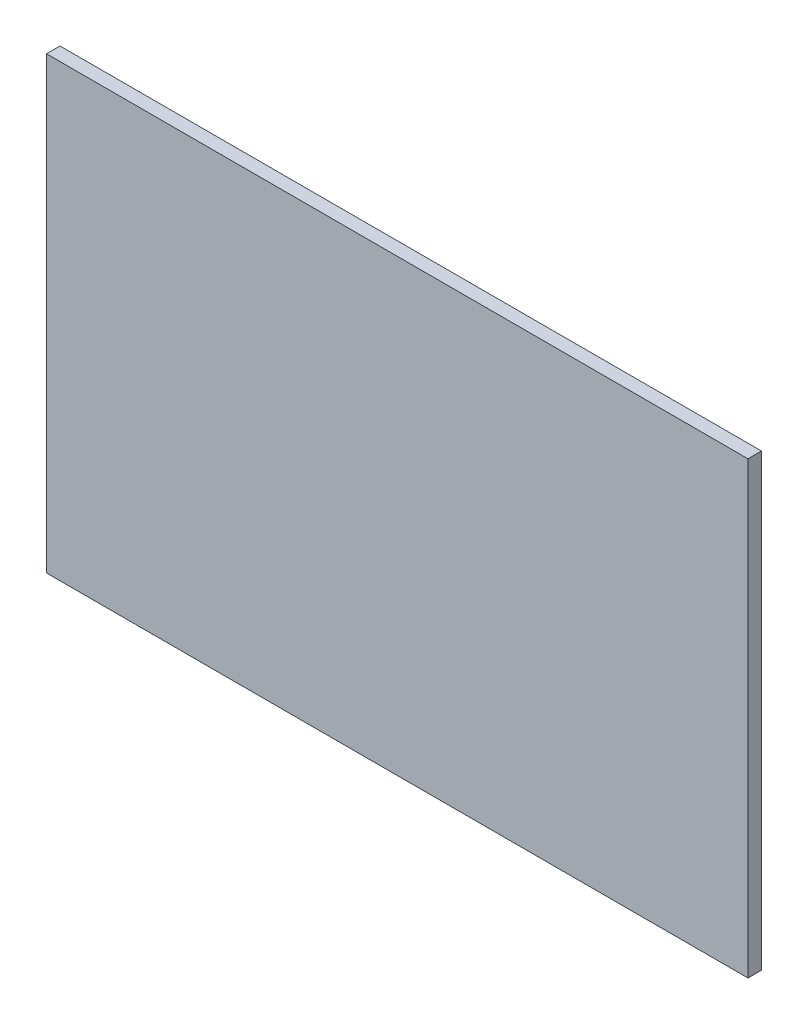
ISO-10303-21;
HEADER;
FILE_DESCRIPTION(('STEP AP214'),'2;1');
FILE_NAME('part.step','',(''),(''),'','','');
FILE_SCHEMA(('AUTOMOTIVE_DESIGN { 1 0 10303 214 1 1 1 1 }'));
ENDSEC;
DATA;
#1=APPLICATION_CONTEXT('core data for automotive mechanical design processes');
#2=APPLICATION_PROTOCOL_DEFINITION('international standard','automotive_design',2000,#1);
#3=PRODUCT_CONTEXT('',#1,'mechanical');
#4=PRODUCT('Part','Part','',(#3));
#5=PRODUCT_RELATED_PRODUCT_CATEGORY('part','',(#4));
#6=PRODUCT_DEFINITION_FORMATION('','',#4);
#7=PRODUCT_DEFINITION_CONTEXT('part definition',#1,'design');
#8=PRODUCT_DEFINITION('design','',#6,#7);
#9=PRODUCT_DEFINITION_SHAPE('','',#8);
#10=(LENGTH_UNIT() NAMED_UNIT(*) SI_UNIT(.MILLI.,.METRE.));
#11=(NAMED_UNIT(*) PLANE_ANGLE_UNIT() SI_UNIT($,.RADIAN.));
#12=(NAMED_UNIT(*) SI_UNIT($,.STERADIAN.) SOLID_ANGLE_UNIT());
#13=UNCERTAINTY_MEASURE_WITH_UNIT(LENGTH_MEASURE(1.E-05),#10,'distance_accuracy_value','');
#14=(GEOMETRIC_REPRESENTATION_CONTEXT(3) GLOBAL_UNCERTAINTY_ASSIGNED_CONTEXT((#13)) GLOBAL_UNIT_ASSIGNED_CONTEXT((#10,
#11,#12)) REPRESENTATION_CONTEXT('',''));
#15=CARTESIAN_POINT('',(0.,0.,0.));
#16=DIRECTION('',(0.,0.,1.));
#17=DIRECTION('',(1.,0.,0.));
#18=AXIS2_PLACEMENT_3D('',#15,#16,#17);
#19=CARTESIAN_POINT('',(78.,-50.,3.));
#20=DIRECTION('',(-1.,0.,0.));
#21=DIRECTION('',(0.,0.,1.));
#22=AXIS2_PLACEMENT_3D('',#19,#20,#21);
#23=PLANE('',#22);
#24=DIRECTION('',(0.,1.,0.));
#25=VECTOR('',#24,1.);
#26=CARTESIAN_POINT('',(78.,-50.,0.));
#27=LINE('',#26,#25);
#28=CARTESIAN_POINT('',(78.,-50.,0.));
#29=VERTEX_POINT('',#28);
#30=CARTESIAN_POINT('',(78.,50.,0.));
#31=VERTEX_POINT('',#30);
#32=EDGE_CURVE('E96',#29,#31,#27,.T.);
#33=ORIENTED_EDGE('',*,*,#32,.T.);
#34=DIRECTION('',(0.,0.,-1.));
#35=VECTOR('',#34,1.);
#36=CARTESIAN_POINT('',(78.,50.,3.));
#37=LINE('',#36,#35);
#38=CARTESIAN_POINT('',(78.,50.,3.));
#39=VERTEX_POINT('',#38);
#40=EDGE_CURVE('E11',#39,#31,#37,.T.);
#41=ORIENTED_EDGE('',*,*,#40,.F.);
#42=DIRECTION('',(0.,1.,0.));
#43=VECTOR('',#42,1.);
#44=CARTESIAN_POINT('',(78.,-50.,3.));
#45=LINE('',#44,#43);
#46=CARTESIAN_POINT('',(78.,-50.,3.));
#47=VERTEX_POINT('',#46);
#48=EDGE_CURVE('E84',#47,#39,#45,.T.);
#49=ORIENTED_EDGE('',*,*,#48,.F.);
#50=DIRECTION('',(0.,0.,-1.));
#51=VECTOR('',#50,1.);
#52=CARTESIAN_POINT('',(78.,-50.,3.));
#53=LINE('',#52,#51);
#54=EDGE_CURVE('E92',#47,#29,#53,.T.);
#55=ORIENTED_EDGE('',*,*,#54,.T.);
#56=EDGE_LOOP('',(#33,#41,#49,#55));
#57=FACE_BOUND('',#56,.T.);
#58=ADVANCED_FACE('F33',(#57),#23,.F.);
#59=CARTESIAN_POINT('',(-78.,50.,3.));
#60=DIRECTION('',(0.,-1.,0.));
#61=DIRECTION('',(0.,0.,-1.));
#62=AXIS2_PLACEMENT_3D('',#59,#60,#61);
#63=PLANE('',#62);
#64=DIRECTION('',(-1.,0.,0.));
#65=VECTOR('',#64,1.);
#66=CARTESIAN_POINT('',(-78.,50.,0.));
#67=LINE('',#66,#65);
#68=CARTESIAN_POINT('',(-78.,50.,0.));
#69=VERTEX_POINT('',#68);
#70=EDGE_CURVE('E88',#31,#69,#67,.T.);
#71=ORIENTED_EDGE('',*,*,#70,.T.);
#72=DIRECTION('',(0.,0.,-1.));
#73=VECTOR('',#72,1.);
#74=CARTESIAN_POINT('',(-78.,50.,3.));
#75=LINE('',#74,#73);
#76=CARTESIAN_POINT('',(-78.,50.,3.));
#77=VERTEX_POINT('',#76);
#78=EDGE_CURVE('E41',#77,#69,#75,.T.);
#79=ORIENTED_EDGE('',*,*,#78,.F.);
#80=DIRECTION('',(-1.,0.,0.));
#81=VECTOR('',#80,1.);
#82=CARTESIAN_POINT('',(-78.,50.,3.));
#83=LINE('',#82,#81);
#84=EDGE_CURVE('E79',#39,#77,#83,.T.);
#85=ORIENTED_EDGE('',*,*,#84,.F.);
#86=ORIENTED_EDGE('',*,*,#40,.T.);
#87=EDGE_LOOP('',(#71,#79,#85,#86));
#88=FACE_BOUND('',#87,.T.);
#89=ADVANCED_FACE('F87',(#88),#63,.F.);
#90=CARTESIAN_POINT('',(-78.,-50.,3.));
#91=DIRECTION('',(1.,0.,0.));
#92=DIRECTION('',(0.,0.,-1.));
#93=AXIS2_PLACEMENT_3D('',#90,#91,#92);
#94=PLANE('',#93);
#95=DIRECTION('',(0.,-1.,0.));
#96=VECTOR('',#95,1.);
#97=CARTESIAN_POINT('',(-78.,-50.,0.));
#98=LINE('',#97,#96);
#99=CARTESIAN_POINT('',(-78.,-50.,0.));
#100=VERTEX_POINT('',#99);
#101=EDGE_CURVE('E66',#69,#100,#98,.T.);
#102=ORIENTED_EDGE('',*,*,#101,.T.);
#103=DIRECTION('',(0.,0.,-1.));
#104=VECTOR('',#103,1.);
#105=CARTESIAN_POINT('',(-78.,-50.,3.));
#106=LINE('',#105,#104);
#107=CARTESIAN_POINT('',(-78.,-50.,3.));
#108=VERTEX_POINT('',#107);
#109=EDGE_CURVE('E89',#108,#100,#106,.T.);
#110=ORIENTED_EDGE('',*,*,#109,.F.);
#111=DIRECTION('',(0.,-1.,0.));
#112=VECTOR('',#111,1.);
#113=CARTESIAN_POINT('',(-78.,-50.,3.));
#114=LINE('',#113,#112);
#115=EDGE_CURVE('E82',#77,#108,#114,.T.);
#116=ORIENTED_EDGE('',*,*,#115,.F.);
#117=ORIENTED_EDGE('',*,*,#78,.T.);
#118=EDGE_LOOP('',(#102,#110,#116,#117));
#119=FACE_BOUND('',#118,.T.);
#120=ADVANCED_FACE('F90',(#119),#94,.F.);
#121=CARTESIAN_POINT('',(-78.,-50.,3.));
#122=DIRECTION('',(0.,1.,0.));
#123=DIRECTION('',(0.,0.,1.));
#124=AXIS2_PLACEMENT_3D('',#121,#122,#123);
#125=PLANE('',#124);
#126=DIRECTION('',(1.,0.,0.));
#127=VECTOR('',#126,1.);
#128=CARTESIAN_POINT('',(-78.,-50.,0.));
#129=LINE('',#128,#127);
#130=EDGE_CURVE('E72',#100,#29,#129,.T.);
#131=ORIENTED_EDGE('',*,*,#130,.T.);
#132=ORIENTED_EDGE('',*,*,#54,.F.);
#133=DIRECTION('',(1.,0.,0.));
#134=VECTOR('',#133,1.);
#135=CARTESIAN_POINT('',(-78.,-50.,3.));
#136=LINE('',#135,#134);
#137=EDGE_CURVE('E49',#108,#47,#136,.T.);
#138=ORIENTED_EDGE('',*,*,#137,.F.);
#139=ORIENTED_EDGE('',*,*,#109,.T.);
#140=EDGE_LOOP('',(#131,#132,#138,#139));
#141=FACE_BOUND('',#140,.T.);
#142=ADVANCED_FACE('F103',(#141),#125,.F.);
#143=CARTESIAN_POINT('',(0.,0.,3.));
#144=DIRECTION('',(0.,0.,-1.));
#145=DIRECTION('',(-1.,0.,0.));
#146=AXIS2_PLACEMENT_3D('',#143,#144,#145);
#147=PLANE('',#146);
#148=ORIENTED_EDGE('',*,*,#48,.T.);
#149=ORIENTED_EDGE('',*,*,#84,.T.);
#150=ORIENTED_EDGE('',*,*,#115,.T.);
#151=ORIENTED_EDGE('',*,*,#137,.T.);
#152=EDGE_LOOP('',(#148,#149,#150,#151));
#153=FACE_BOUND('',#152,.T.);
#154=ADVANCED_FACE('F80',(#153),#147,.F.);
#155=CARTESIAN_POINT('',(0.,0.,0.));
#156=DIRECTION('',(0.,0.,-1.));
#157=DIRECTION('',(-1.,0.,0.));
#158=AXIS2_PLACEMENT_3D('',#155,#156,#157);
#159=PLANE('',#158);
#160=ORIENTED_EDGE('',*,*,#32,.F.);
#161=ORIENTED_EDGE('',*,*,#130,.F.);
#162=ORIENTED_EDGE('',*,*,#101,.F.);
#163=ORIENTED_EDGE('',*,*,#70,.F.);
#164=EDGE_LOOP('',(#160,#161,#162,#163));
#165=FACE_BOUND('',#164,.T.);
#166=ADVANCED_FACE('F106',(#165),#159,.T.);
#167=CLOSED_SHELL('',(#58,#89,#120,#142,#154,#166));
#168=MANIFOLD_SOLID_BREP('B2',#167);
#169=ADVANCED_BREP_SHAPE_REPRESENTATION('',(#18,#168),#14);
#170=SHAPE_DEFINITION_REPRESENTATION(#9,#169);
ENDSEC;
END-ISO-10303-21;
